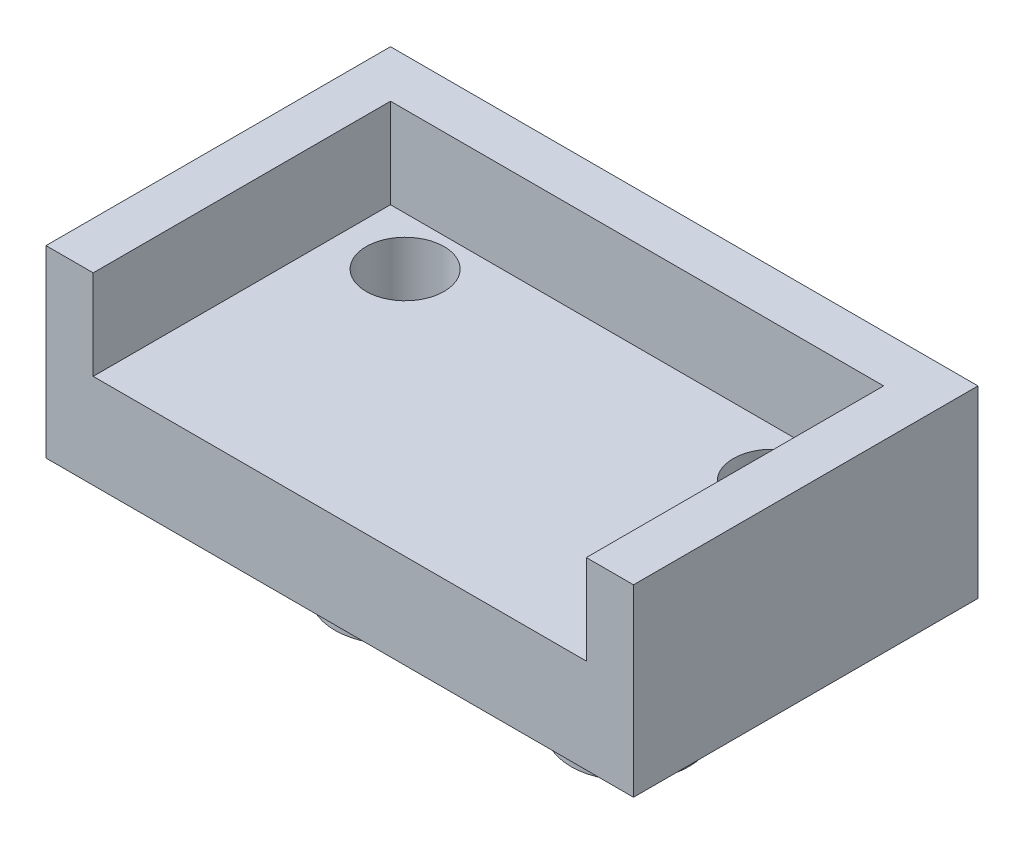
ISO-10303-21;
HEADER;
FILE_DESCRIPTION(('STEP AP214'),'2;1');
FILE_NAME('part.step','',(''),(''),'','','');
FILE_SCHEMA(('AUTOMOTIVE_DESIGN { 1 0 10303 214 1 1 1 1 }'));
ENDSEC;
DATA;
#1=APPLICATION_CONTEXT('core data for automotive mechanical design processes');
#2=APPLICATION_PROTOCOL_DEFINITION('international standard','automotive_design',2000,#1);
#3=PRODUCT_CONTEXT('',#1,'mechanical');
#4=PRODUCT('Part','Part','',(#3));
#5=PRODUCT_RELATED_PRODUCT_CATEGORY('part','',(#4));
#6=PRODUCT_DEFINITION_FORMATION('','',#4);
#7=PRODUCT_DEFINITION_CONTEXT('part definition',#1,'design');
#8=PRODUCT_DEFINITION('design','',#6,#7);
#9=PRODUCT_DEFINITION_SHAPE('','',#8);
#10=(LENGTH_UNIT() NAMED_UNIT(*) SI_UNIT(.MILLI.,.METRE.));
#11=(NAMED_UNIT(*) PLANE_ANGLE_UNIT() SI_UNIT($,.RADIAN.));
#12=(NAMED_UNIT(*) SI_UNIT($,.STERADIAN.) SOLID_ANGLE_UNIT());
#13=UNCERTAINTY_MEASURE_WITH_UNIT(LENGTH_MEASURE(1.E-05),#10,'distance_accuracy_value','');
#14=(GEOMETRIC_REPRESENTATION_CONTEXT(3) GLOBAL_UNCERTAINTY_ASSIGNED_CONTEXT((#13)) GLOBAL_UNIT_ASSIGNED_CONTEXT((#10,
#11,#12)) REPRESENTATION_CONTEXT('',''));
#15=CARTESIAN_POINT('',(0.,0.,0.));
#16=DIRECTION('',(0.,0.,1.));
#17=DIRECTION('',(1.,0.,0.));
#18=AXIS2_PLACEMENT_3D('',#15,#16,#17);
#19=CARTESIAN_POINT('',(0.,-4.,0.));
#20=DIRECTION('',(0.,1.,0.));
#21=DIRECTION('',(0.,0.,1.));
#22=AXIS2_PLACEMENT_3D('',#19,#20,#21);
#23=PLANE('',#22);
#24=DIRECTION('',(1.,0.,0.));
#25=VECTOR('',#24,1.);
#26=CARTESIAN_POINT('',(0.,-4.,0.));
#27=LINE('',#26,#25);
#28=CARTESIAN_POINT('',(-2.,-4.,0.));
#29=VERTEX_POINT('',#28);
#30=CARTESIAN_POINT('',(22.9,-4.,0.));
#31=VERTEX_POINT('',#30);
#32=EDGE_CURVE('E130',#29,#31,#27,.T.);
#33=ORIENTED_EDGE('',*,*,#32,.F.);
#34=DIRECTION('',(0.,0.,-1.));
#35=VECTOR('',#34,1.);
#36=CARTESIAN_POINT('',(-2.,-4.,0.));
#37=LINE('',#36,#35);
#38=CARTESIAN_POINT('',(-2.,-4.,-14.6));
#39=VERTEX_POINT('',#38);
#40=EDGE_CURVE('E150',#29,#39,#37,.T.);
#41=ORIENTED_EDGE('',*,*,#40,.T.);
#42=DIRECTION('',(1.,0.,0.));
#43=VECTOR('',#42,1.);
#44=CARTESIAN_POINT('',(0.,-4.,-14.6));
#45=LINE('',#44,#43);
#46=CARTESIAN_POINT('',(22.9,-4.,-14.6));
#47=VERTEX_POINT('',#46);
#48=EDGE_CURVE('E132',#39,#47,#45,.T.);
#49=ORIENTED_EDGE('',*,*,#48,.T.);
#50=DIRECTION('',(0.,0.,-1.));
#51=VECTOR('',#50,1.);
#52=CARTESIAN_POINT('',(22.9,-4.,0.));
#53=LINE('',#52,#51);
#54=EDGE_CURVE('E116',#31,#47,#53,.T.);
#55=ORIENTED_EDGE('',*,*,#54,.F.);
#56=EDGE_LOOP('',(#33,#41,#49,#55));
#57=FACE_BOUND('',#56,.T.);
#58=CARTESIAN_POINT('',(5.45,-4.,-7.3));
#59=DIRECTION('',(0.,1.,0.));
#60=DIRECTION('',(0.,0.,1.));
#61=AXIS2_PLACEMENT_3D('',#58,#59,#60);
#62=CIRCLE('',#61,2.5);
#63=CARTESIAN_POINT('',(5.45,-4.,-4.8));
#64=VERTEX_POINT('',#63);
#65=EDGE_CURVE('E59',#64,#64,#62,.F.);
#66=ORIENTED_EDGE('',*,*,#65,.F.);
#67=EDGE_LOOP('',(#66));
#68=FACE_BOUND('',#67,.T.);
#69=CARTESIAN_POINT('',(15.45,-4.,-7.3));
#70=DIRECTION('',(0.,1.,0.));
#71=DIRECTION('',(0.,0.,1.));
#72=AXIS2_PLACEMENT_3D('',#69,#70,#71);
#73=CIRCLE('',#72,2.5);
#74=CARTESIAN_POINT('',(15.45,-4.,-4.8));
#75=VERTEX_POINT('',#74);
#76=EDGE_CURVE('E11',#75,#75,#73,.F.);
#77=ORIENTED_EDGE('',*,*,#76,.F.);
#78=EDGE_LOOP('',(#77));
#79=FACE_BOUND('',#78,.T.);
#80=CARTESIAN_POINT('',(18.23,-4.,-10.55));
#81=DIRECTION('',(0.,1.,0.));
#82=DIRECTION('',(0.,0.,1.));
#83=AXIS2_PLACEMENT_3D('',#80,#81,#82);
#84=CIRCLE('',#83,1.65);
#85=CARTESIAN_POINT('',(18.23,-4.,-8.9));
#86=VERTEX_POINT('',#85);
#87=EDGE_CURVE('E224',#86,#86,#84,.T.);
#88=ORIENTED_EDGE('',*,*,#87,.T.);
#89=EDGE_LOOP('',(#88));
#90=FACE_BOUND('',#89,.T.);
#91=CARTESIAN_POINT('',(2.67,-4.,-10.55));
#92=DIRECTION('',(0.,1.,0.));
#93=DIRECTION('',(0.,0.,1.));
#94=AXIS2_PLACEMENT_3D('',#91,#92,#93);
#95=CIRCLE('',#94,1.65);
#96=CARTESIAN_POINT('',(2.67,-4.,-8.9));
#97=VERTEX_POINT('',#96);
#98=EDGE_CURVE('E227',#97,#97,#95,.F.);
#99=ORIENTED_EDGE('',*,*,#98,.F.);
#100=EDGE_LOOP('',(#99));
#101=FACE_BOUND('',#100,.T.);
#102=ADVANCED_FACE('F49',(#57,#68,#79,#90,#101),#23,.F.);
#103=CARTESIAN_POINT('',(0.,0.,0.));
#104=DIRECTION('',(0.,1.,0.));
#105=DIRECTION('',(0.,0.,1.));
#106=AXIS2_PLACEMENT_3D('',#103,#104,#105);
#107=PLANE('',#106);
#108=CARTESIAN_POINT('',(18.23,0.,-10.55));
#109=DIRECTION('',(0.,-1.,0.));
#110=DIRECTION('',(0.,0.,-1.));
#111=AXIS2_PLACEMENT_3D('',#108,#109,#110);
#112=CIRCLE('',#111,1.65);
#113=CARTESIAN_POINT('',(18.23,0.,-12.2));
#114=VERTEX_POINT('',#113);
#115=EDGE_CURVE('E237',#114,#114,#112,.T.);
#116=ORIENTED_EDGE('',*,*,#115,.T.);
#117=EDGE_LOOP('',(#116));
#118=FACE_BOUND('',#117,.T.);
#119=DIRECTION('',(1.,0.,0.));
#120=VECTOR('',#119,1.);
#121=CARTESIAN_POINT('',(0.,0.,0.));
#122=LINE('',#121,#120);
#123=CARTESIAN_POINT('',(0.,0.,0.));
#124=VERTEX_POINT('',#123);
#125=CARTESIAN_POINT('',(20.9,0.,0.));
#126=VERTEX_POINT('',#125);
#127=EDGE_CURVE('E140',#124,#126,#122,.T.);
#128=ORIENTED_EDGE('',*,*,#127,.T.);
#129=DIRECTION('',(0.,0.,-1.));
#130=VECTOR('',#129,1.);
#131=CARTESIAN_POINT('',(20.9,0.,0.));
#132=LINE('',#131,#130);
#133=CARTESIAN_POINT('',(20.9,0.,-12.6));
#134=VERTEX_POINT('',#133);
#135=EDGE_CURVE('E152',#126,#134,#132,.T.);
#136=ORIENTED_EDGE('',*,*,#135,.T.);
#137=DIRECTION('',(1.,0.,0.));
#138=VECTOR('',#137,1.);
#139=CARTESIAN_POINT('',(0.,0.,-12.6));
#140=LINE('',#139,#138);
#141=CARTESIAN_POINT('',(0.,0.,-12.6));
#142=VERTEX_POINT('',#141);
#143=EDGE_CURVE('E159',#142,#134,#140,.T.);
#144=ORIENTED_EDGE('',*,*,#143,.F.);
#145=DIRECTION('',(0.,0.,-1.));
#146=VECTOR('',#145,1.);
#147=CARTESIAN_POINT('',(0.,0.,0.));
#148=LINE('',#147,#146);
#149=EDGE_CURVE('E183',#124,#142,#148,.T.);
#150=ORIENTED_EDGE('',*,*,#149,.F.);
#151=EDGE_LOOP('',(#128,#136,#144,#150));
#152=FACE_BOUND('',#151,.T.);
#153=CARTESIAN_POINT('',(2.67,0.,-10.55));
#154=DIRECTION('',(0.,1.,0.));
#155=DIRECTION('',(0.,0.,1.));
#156=AXIS2_PLACEMENT_3D('',#153,#154,#155);
#157=CIRCLE('',#156,1.65);
#158=CARTESIAN_POINT('',(2.67,0.,-8.9));
#159=VERTEX_POINT('',#158);
#160=EDGE_CURVE('E231',#159,#159,#157,.T.);
#161=ORIENTED_EDGE('',*,*,#160,.F.);
#162=EDGE_LOOP('',(#161));
#163=FACE_BOUND('',#162,.T.);
#164=ADVANCED_FACE('F217',(#118,#152,#163),#107,.T.);
#165=CARTESIAN_POINT('',(20.9,3.8,0.));
#166=DIRECTION('',(-1.,0.,0.));
#167=DIRECTION('',(0.,0.,1.));
#168=AXIS2_PLACEMENT_3D('',#165,#166,#167);
#169=PLANE('',#168);
#170=ORIENTED_EDGE('',*,*,#135,.F.);
#171=DIRECTION('',(0.,-1.,0.));
#172=VECTOR('',#171,1.);
#173=CARTESIAN_POINT('',(20.9,3.8,0.));
#174=LINE('',#173,#172);
#175=CARTESIAN_POINT('',(20.9,3.8,0.));
#176=VERTEX_POINT('',#175);
#177=EDGE_CURVE('E122',#176,#126,#174,.T.);
#178=ORIENTED_EDGE('',*,*,#177,.F.);
#179=DIRECTION('',(0.,0.,-1.));
#180=VECTOR('',#179,1.);
#181=CARTESIAN_POINT('',(20.9,3.8,0.));
#182=LINE('',#181,#180);
#183=CARTESIAN_POINT('',(20.9,3.8,-12.6));
#184=VERTEX_POINT('',#183);
#185=EDGE_CURVE('E154',#176,#184,#182,.T.);
#186=ORIENTED_EDGE('',*,*,#185,.T.);
#187=DIRECTION('',(0.,-1.,0.));
#188=VECTOR('',#187,1.);
#189=CARTESIAN_POINT('',(20.9,3.8,-12.6));
#190=LINE('',#189,#188);
#191=EDGE_CURVE('E180',#184,#134,#190,.T.);
#192=ORIENTED_EDGE('',*,*,#191,.T.);
#193=EDGE_LOOP('',(#170,#178,#186,#192));
#194=FACE_BOUND('',#193,.T.);
#195=ADVANCED_FACE('F51',(#194),#169,.T.);
#196=CARTESIAN_POINT('',(22.9,3.8,0.));
#197=DIRECTION('',(-1.,0.,0.));
#198=DIRECTION('',(0.,0.,1.));
#199=AXIS2_PLACEMENT_3D('',#196,#197,#198);
#200=PLANE('',#199);
#201=DIRECTION('',(0.,-1.,0.));
#202=VECTOR('',#201,1.);
#203=CARTESIAN_POINT('',(22.9,3.8,0.));
#204=LINE('',#203,#202);
#205=CARTESIAN_POINT('',(22.9,3.8,0.));
#206=VERTEX_POINT('',#205);
#207=EDGE_CURVE('E112',#206,#31,#204,.T.);
#208=ORIENTED_EDGE('',*,*,#207,.T.);
#209=ORIENTED_EDGE('',*,*,#54,.T.);
#210=DIRECTION('',(0.,-1.,0.));
#211=VECTOR('',#210,1.);
#212=CARTESIAN_POINT('',(22.9,3.8,-14.6));
#213=LINE('',#212,#211);
#214=CARTESIAN_POINT('',(22.9,3.8,-14.6));
#215=VERTEX_POINT('',#214);
#216=EDGE_CURVE('E123',#215,#47,#213,.T.);
#217=ORIENTED_EDGE('',*,*,#216,.F.);
#218=DIRECTION('',(0.,0.,-1.));
#219=VECTOR('',#218,1.);
#220=CARTESIAN_POINT('',(22.9,3.8,0.));
#221=LINE('',#220,#219);
#222=EDGE_CURVE('E117',#206,#215,#221,.T.);
#223=ORIENTED_EDGE('',*,*,#222,.F.);
#224=EDGE_LOOP('',(#208,#209,#217,#223));
#225=FACE_BOUND('',#224,.T.);
#226=ADVANCED_FACE('F114',(#225),#200,.F.);
#227=CARTESIAN_POINT('',(0.,3.8,-14.6));
#228=DIRECTION('',(0.,0.,-1.));
#229=DIRECTION('',(-1.,0.,0.));
#230=AXIS2_PLACEMENT_3D('',#227,#228,#229);
#231=PLANE('',#230);
#232=ORIENTED_EDGE('',*,*,#216,.T.);
#233=ORIENTED_EDGE('',*,*,#48,.F.);
#234=DIRECTION('',(0.,-1.,0.));
#235=VECTOR('',#234,1.);
#236=CARTESIAN_POINT('',(-2.,3.8,-14.6));
#237=LINE('',#236,#235);
#238=CARTESIAN_POINT('',(-2.,3.8,-14.6));
#239=VERTEX_POINT('',#238);
#240=EDGE_CURVE('E203',#239,#39,#237,.T.);
#241=ORIENTED_EDGE('',*,*,#240,.F.);
#242=DIRECTION('',(1.,0.,0.));
#243=VECTOR('',#242,1.);
#244=CARTESIAN_POINT('',(0.,3.8,-14.6));
#245=LINE('',#244,#243);
#246=EDGE_CURVE('E164',#239,#215,#245,.T.);
#247=ORIENTED_EDGE('',*,*,#246,.T.);
#248=EDGE_LOOP('',(#232,#233,#241,#247));
#249=FACE_BOUND('',#248,.T.);
#250=ADVANCED_FACE('F291',(#249),#231,.T.);
#251=CARTESIAN_POINT('',(-2.,3.8,0.));
#252=DIRECTION('',(-1.,0.,0.));
#253=DIRECTION('',(0.,0.,1.));
#254=AXIS2_PLACEMENT_3D('',#251,#252,#253);
#255=PLANE('',#254);
#256=ORIENTED_EDGE('',*,*,#240,.T.);
#257=ORIENTED_EDGE('',*,*,#40,.F.);
#258=DIRECTION('',(0.,-1.,0.));
#259=VECTOR('',#258,1.);
#260=CARTESIAN_POINT('',(-2.,3.8,0.));
#261=LINE('',#260,#259);
#262=CARTESIAN_POINT('',(-2.,3.8,0.));
#263=VERTEX_POINT('',#262);
#264=EDGE_CURVE('E137',#263,#29,#261,.T.);
#265=ORIENTED_EDGE('',*,*,#264,.F.);
#266=DIRECTION('',(0.,0.,-1.));
#267=VECTOR('',#266,1.);
#268=CARTESIAN_POINT('',(-2.,3.8,0.));
#269=LINE('',#268,#267);
#270=EDGE_CURVE('E168',#263,#239,#269,.T.);
#271=ORIENTED_EDGE('',*,*,#270,.T.);
#272=EDGE_LOOP('',(#256,#257,#265,#271));
#273=FACE_BOUND('',#272,.T.);
#274=ADVANCED_FACE('F288',(#273),#255,.T.);
#275=CARTESIAN_POINT('',(0.,3.8,0.));
#276=DIRECTION('',(0.,0.,-1.));
#277=DIRECTION('',(-1.,0.,0.));
#278=AXIS2_PLACEMENT_3D('',#275,#276,#277);
#279=PLANE('',#278);
#280=ORIENTED_EDGE('',*,*,#264,.T.);
#281=ORIENTED_EDGE('',*,*,#32,.T.);
#282=ORIENTED_EDGE('',*,*,#207,.F.);
#283=DIRECTION('',(1.,0.,0.));
#284=VECTOR('',#283,1.);
#285=CARTESIAN_POINT('',(0.,3.8,0.));
#286=LINE('',#285,#284);
#287=EDGE_CURVE('E158',#176,#206,#286,.T.);
#288=ORIENTED_EDGE('',*,*,#287,.F.);
#289=ORIENTED_EDGE('',*,*,#177,.T.);
#290=ORIENTED_EDGE('',*,*,#127,.F.);
#291=DIRECTION('',(0.,-1.,0.));
#292=VECTOR('',#291,1.);
#293=CARTESIAN_POINT('',(0.,3.8,0.));
#294=LINE('',#293,#292);
#295=CARTESIAN_POINT('',(0.,3.8,0.));
#296=VERTEX_POINT('',#295);
#297=EDGE_CURVE('E197',#296,#124,#294,.T.);
#298=ORIENTED_EDGE('',*,*,#297,.F.);
#299=DIRECTION('',(1.,0.,0.));
#300=VECTOR('',#299,1.);
#301=CARTESIAN_POINT('',(0.,3.8,0.));
#302=LINE('',#301,#300);
#303=EDGE_CURVE('E172',#263,#296,#302,.T.);
#304=ORIENTED_EDGE('',*,*,#303,.F.);
#305=EDGE_LOOP('',(#280,#281,#282,#288,#289,#290,#298,#304));
#306=FACE_BOUND('',#305,.T.);
#307=ADVANCED_FACE('F135',(#306),#279,.F.);
#308=CARTESIAN_POINT('',(0.,3.8,0.));
#309=DIRECTION('',(-1.,0.,0.));
#310=DIRECTION('',(0.,0.,1.));
#311=AXIS2_PLACEMENT_3D('',#308,#309,#310);
#312=PLANE('',#311);
#313=ORIENTED_EDGE('',*,*,#149,.T.);
#314=DIRECTION('',(0.,-1.,0.));
#315=VECTOR('',#314,1.);
#316=CARTESIAN_POINT('',(0.,3.8,-12.6));
#317=LINE('',#316,#315);
#318=CARTESIAN_POINT('',(0.,3.8,-12.6));
#319=VERTEX_POINT('',#318);
#320=EDGE_CURVE('E193',#319,#142,#317,.T.);
#321=ORIENTED_EDGE('',*,*,#320,.F.);
#322=DIRECTION('',(0.,0.,-1.));
#323=VECTOR('',#322,1.);
#324=CARTESIAN_POINT('',(0.,3.8,0.));
#325=LINE('',#324,#323);
#326=EDGE_CURVE('E175',#296,#319,#325,.T.);
#327=ORIENTED_EDGE('',*,*,#326,.F.);
#328=ORIENTED_EDGE('',*,*,#297,.T.);
#329=EDGE_LOOP('',(#313,#321,#327,#328));
#330=FACE_BOUND('',#329,.T.);
#331=ADVANCED_FACE('F281',(#330),#312,.F.);
#332=CARTESIAN_POINT('',(0.,3.8,-12.6));
#333=DIRECTION('',(0.,0.,-1.));
#334=DIRECTION('',(-1.,0.,0.));
#335=AXIS2_PLACEMENT_3D('',#332,#333,#334);
#336=PLANE('',#335);
#337=ORIENTED_EDGE('',*,*,#143,.T.);
#338=ORIENTED_EDGE('',*,*,#191,.F.);
#339=DIRECTION('',(1.,0.,0.));
#340=VECTOR('',#339,1.);
#341=CARTESIAN_POINT('',(0.,3.8,-12.6));
#342=LINE('',#341,#340);
#343=EDGE_CURVE('E66',#319,#184,#342,.T.);
#344=ORIENTED_EDGE('',*,*,#343,.F.);
#345=ORIENTED_EDGE('',*,*,#320,.T.);
#346=EDGE_LOOP('',(#337,#338,#344,#345));
#347=FACE_BOUND('',#346,.T.);
#348=ADVANCED_FACE('F278',(#347),#336,.F.);
#349=CARTESIAN_POINT('',(0.,3.8,0.));
#350=DIRECTION('',(0.,1.,0.));
#351=DIRECTION('',(0.,0.,1.));
#352=AXIS2_PLACEMENT_3D('',#349,#350,#351);
#353=PLANE('',#352);
#354=ORIENTED_EDGE('',*,*,#185,.F.);
#355=ORIENTED_EDGE('',*,*,#287,.T.);
#356=ORIENTED_EDGE('',*,*,#222,.T.);
#357=ORIENTED_EDGE('',*,*,#246,.F.);
#358=ORIENTED_EDGE('',*,*,#270,.F.);
#359=ORIENTED_EDGE('',*,*,#303,.T.);
#360=ORIENTED_EDGE('',*,*,#326,.T.);
#361=ORIENTED_EDGE('',*,*,#343,.T.);
#362=EDGE_LOOP('',(#354,#355,#356,#357,#358,#359,#360,#361));
#363=FACE_BOUND('',#362,.T.);
#364=ADVANCED_FACE('F272',(#363),#353,.T.);
#365=CARTESIAN_POINT('',(5.45,-9.,-7.3));
#366=DIRECTION('',(0.,1.,0.));
#367=DIRECTION('',(0.,0.,1.));
#368=AXIS2_PLACEMENT_3D('',#365,#366,#367);
#369=CYLINDRICAL_SURFACE('',#368,2.5);
#370=CARTESIAN_POINT('',(5.45,-9.,-7.3));
#371=DIRECTION('',(0.,-1.,0.));
#372=DIRECTION('',(0.,0.,-1.));
#373=AXIS2_PLACEMENT_3D('',#370,#371,#372);
#374=CIRCLE('',#373,2.5);
#375=CARTESIAN_POINT('',(5.45,-9.,-9.8));
#376=VERTEX_POINT('',#375);
#377=EDGE_CURVE('E143',#376,#376,#374,.T.);
#378=ORIENTED_EDGE('',*,*,#377,.F.);
#379=EDGE_LOOP('',(#378));
#380=FACE_BOUND('',#379,.T.);
#381=ORIENTED_EDGE('',*,*,#65,.T.);
#382=EDGE_LOOP('',(#381));
#383=FACE_BOUND('',#382,.T.);
#384=ADVANCED_FACE('F214',(#380,#383),#369,.T.);
#385=CARTESIAN_POINT('',(5.45,-9.,-7.3));
#386=DIRECTION('',(0.,-1.,0.));
#387=DIRECTION('',(0.,0.,-1.));
#388=AXIS2_PLACEMENT_3D('',#385,#386,#387);
#389=PLANE('',#388);
#390=ORIENTED_EDGE('',*,*,#377,.T.);
#391=EDGE_LOOP('',(#390));
#392=FACE_BOUND('',#391,.T.);
#393=ADVANCED_FACE('F265',(#392),#389,.T.);
#394=CARTESIAN_POINT('',(15.45,-9.,-7.3));
#395=DIRECTION('',(0.,1.,0.));
#396=DIRECTION('',(0.,0.,1.));
#397=AXIS2_PLACEMENT_3D('',#394,#395,#396);
#398=CYLINDRICAL_SURFACE('',#397,2.5);
#399=CARTESIAN_POINT('',(15.45,-9.,-7.3));
#400=DIRECTION('',(0.,-1.,0.));
#401=DIRECTION('',(0.,0.,1.));
#402=AXIS2_PLACEMENT_3D('',#399,#400,#401);
#403=CIRCLE('',#402,2.5);
#404=CARTESIAN_POINT('',(15.45,-9.,-4.8));
#405=VERTEX_POINT('',#404);
#406=EDGE_CURVE('E230',#405,#405,#403,.T.);
#407=ORIENTED_EDGE('',*,*,#406,.F.);
#408=EDGE_LOOP('',(#407));
#409=FACE_BOUND('',#408,.T.);
#410=ORIENTED_EDGE('',*,*,#76,.T.);
#411=EDGE_LOOP('',(#410));
#412=FACE_BOUND('',#411,.T.);
#413=ADVANCED_FACE('F260',(#409,#412),#398,.T.);
#414=CARTESIAN_POINT('',(15.45,-9.,-7.3));
#415=DIRECTION('',(0.,1.,0.));
#416=DIRECTION('',(0.,0.,1.));
#417=AXIS2_PLACEMENT_3D('',#414,#415,#416);
#418=PLANE('',#417);
#419=ORIENTED_EDGE('',*,*,#406,.T.);
#420=EDGE_LOOP('',(#419));
#421=FACE_BOUND('',#420,.T.);
#422=ADVANCED_FACE('F251',(#421),#418,.F.);
#423=CARTESIAN_POINT('',(18.23,-8.66690475583121,-10.55));
#424=DIRECTION('',(0.,1.,0.));
#425=DIRECTION('',(0.,0.,1.));
#426=AXIS2_PLACEMENT_3D('',#423,#424,#425);
#427=CYLINDRICAL_SURFACE('',#426,1.65);
#428=ORIENTED_EDGE('',*,*,#87,.F.);
#429=EDGE_LOOP('',(#428));
#430=FACE_BOUND('',#429,.T.);
#431=ORIENTED_EDGE('',*,*,#115,.F.);
#432=EDGE_LOOP('',(#431));
#433=FACE_BOUND('',#432,.T.);
#434=ADVANCED_FACE('F248',(#430,#433),#427,.F.);
#435=CARTESIAN_POINT('',(2.67,-8.66690475583121,-10.55));
#436=DIRECTION('',(0.,1.,0.));
#437=DIRECTION('',(0.,0.,1.));
#438=AXIS2_PLACEMENT_3D('',#435,#436,#437);
#439=CYLINDRICAL_SURFACE('',#438,1.65);
#440=ORIENTED_EDGE('',*,*,#98,.T.);
#441=EDGE_LOOP('',(#440));
#442=FACE_BOUND('',#441,.T.);
#443=ORIENTED_EDGE('',*,*,#160,.T.);
#444=EDGE_LOOP('',(#443));
#445=FACE_BOUND('',#444,.T.);
#446=ADVANCED_FACE('F250',(#442,#445),#439,.F.);
#447=CLOSED_SHELL('',(#102,#164,#195,#226,#250,#274,#307,#331,#348,#364,#384,#393,#413,#422,
#434,#446));
#448=MANIFOLD_SOLID_BREP('B2',#447);
#449=ADVANCED_BREP_SHAPE_REPRESENTATION('',(#18,#448),#14);
#450=SHAPE_DEFINITION_REPRESENTATION(#9,#449);
ENDSEC;
END-ISO-10303-21;
